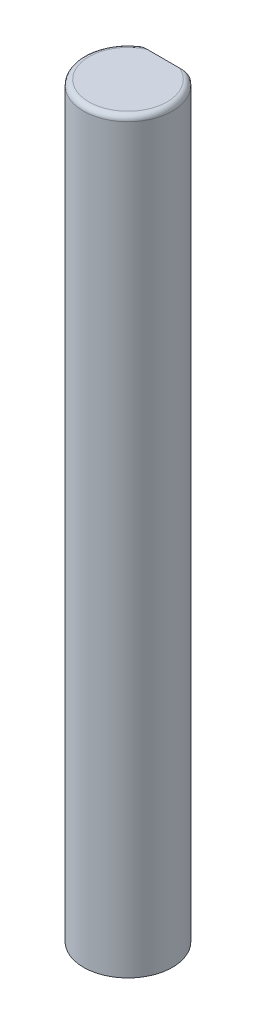
ISO-10303-21;
HEADER;
FILE_DESCRIPTION(('STEP AP214'),'2;1');
FILE_NAME('part.step','',(''),(''),'','','');
FILE_SCHEMA(('AUTOMOTIVE_DESIGN { 1 0 10303 214 1 1 1 1 }'));
ENDSEC;
DATA;
#1=APPLICATION_CONTEXT('core data for automotive mechanical design processes');
#2=APPLICATION_PROTOCOL_DEFINITION('international standard','automotive_design',2000,#1);
#3=PRODUCT_CONTEXT('',#1,'mechanical');
#4=PRODUCT('Part','Part','',(#3));
#5=PRODUCT_RELATED_PRODUCT_CATEGORY('part','',(#4));
#6=PRODUCT_DEFINITION_FORMATION('','',#4);
#7=PRODUCT_DEFINITION_CONTEXT('part definition',#1,'design');
#8=PRODUCT_DEFINITION('design','',#6,#7);
#9=PRODUCT_DEFINITION_SHAPE('','',#8);
#10=(LENGTH_UNIT() NAMED_UNIT(*) SI_UNIT(.MILLI.,.METRE.));
#11=(NAMED_UNIT(*) PLANE_ANGLE_UNIT() SI_UNIT($,.RADIAN.));
#12=(NAMED_UNIT(*) SI_UNIT($,.STERADIAN.) SOLID_ANGLE_UNIT());
#13=UNCERTAINTY_MEASURE_WITH_UNIT(LENGTH_MEASURE(1.E-05),#10,'distance_accuracy_value','');
#14=(GEOMETRIC_REPRESENTATION_CONTEXT(3) GLOBAL_UNCERTAINTY_ASSIGNED_CONTEXT((#13)) GLOBAL_UNIT_ASSIGNED_CONTEXT((#10,
#11,#12)) REPRESENTATION_CONTEXT('',''));
#15=CARTESIAN_POINT('',(0.,0.,0.));
#16=DIRECTION('',(0.,0.,1.));
#17=DIRECTION('',(1.,0.,0.));
#18=AXIS2_PLACEMENT_3D('',#15,#16,#17);
#19=CARTESIAN_POINT('',(0.,42.,0.));
#20=DIRECTION('',(0.,-1.,0.));
#21=DIRECTION('',(0.,0.,-1.));
#22=AXIS2_PLACEMENT_3D('',#19,#20,#21);
#23=CYLINDRICAL_SURFACE('',#22,2.5);
#24=DIRECTION('',(0.,-1.,0.));
#25=VECTOR('',#24,1.);
#26=CARTESIAN_POINT('',(1.5,42.,-2.));
#27=LINE('',#26,#25);
#28=CARTESIAN_POINT('',(1.5,24.,-2.));
#29=VERTEX_POINT('',#28);
#30=CARTESIAN_POINT('',(1.5,41.7,-2.));
#31=VERTEX_POINT('',#30);
#32=EDGE_CURVE('E85',#29,#31,#27,.F.);
#33=ORIENTED_EDGE('',*,*,#32,.T.);
#34=CARTESIAN_POINT('',(0.,41.7,0.));
#35=DIRECTION('',(0.,1.,0.));
#36=DIRECTION('',(0.,0.,1.));
#37=AXIS2_PLACEMENT_3D('',#34,#35,#36);
#38=CIRCLE('',#37,2.5);
#39=CARTESIAN_POINT('',(-1.5,41.7,-2.));
#40=VERTEX_POINT('',#39);
#41=EDGE_CURVE('E11',#31,#40,#38,.F.);
#42=ORIENTED_EDGE('',*,*,#41,.T.);
#43=DIRECTION('',(0.,-1.,0.));
#44=VECTOR('',#43,1.);
#45=CARTESIAN_POINT('',(-1.5,42.,-2.));
#46=LINE('',#45,#44);
#47=CARTESIAN_POINT('',(-1.5,24.,-2.));
#48=VERTEX_POINT('',#47);
#49=EDGE_CURVE('E77',#40,#48,#46,.T.);
#50=ORIENTED_EDGE('',*,*,#49,.T.);
#51=CARTESIAN_POINT('',(0.,24.,0.));
#52=DIRECTION('',(0.,-1.,0.));
#53=DIRECTION('',(0.,0.,-1.));
#54=AXIS2_PLACEMENT_3D('',#51,#52,#53);
#55=CIRCLE('',#54,2.5);
#56=EDGE_CURVE('E80',#48,#29,#55,.T.);
#57=ORIENTED_EDGE('',*,*,#56,.T.);
#58=EDGE_LOOP('',(#33,#42,#50,#57));
#59=FACE_BOUND('',#58,.T.);
#60=CARTESIAN_POINT('',(0.,0.,0.));
#61=DIRECTION('',(0.,1.,0.));
#62=DIRECTION('',(0.,0.,1.));
#63=AXIS2_PLACEMENT_3D('',#60,#61,#62);
#64=CIRCLE('',#63,2.5);
#65=CARTESIAN_POINT('',(0.,0.,2.5));
#66=VERTEX_POINT('',#65);
#67=EDGE_CURVE('E84',#66,#66,#64,.T.);
#68=ORIENTED_EDGE('',*,*,#67,.T.);
#69=EDGE_LOOP('',(#68));
#70=FACE_BOUND('',#69,.T.);
#71=ADVANCED_FACE('F45',(#59,#70),#23,.T.);
#72=CARTESIAN_POINT('',(0.,42.,0.));
#73=DIRECTION('',(0.,1.,0.));
#74=DIRECTION('',(0.,0.,1.));
#75=AXIS2_PLACEMENT_3D('',#72,#73,#74);
#76=PLANE('',#75);
#77=DIRECTION('',(1.,0.,0.));
#78=VECTOR('',#77,1.);
#79=CARTESIAN_POINT('',(0.,42.,-2.));
#80=LINE('',#79,#78);
#81=CARTESIAN_POINT('',(-0.916515138991167,42.,-2.));
#82=VERTEX_POINT('',#81);
#83=CARTESIAN_POINT('',(0.916515138991167,42.,-2.));
#84=VERTEX_POINT('',#83);
#85=EDGE_CURVE('E93',#82,#84,#80,.T.);
#86=ORIENTED_EDGE('',*,*,#85,.F.);
#87=CARTESIAN_POINT('',(0.,42.,0.));
#88=DIRECTION('',(0.,1.,0.));
#89=DIRECTION('',(0.,0.,1.));
#90=AXIS2_PLACEMENT_3D('',#87,#88,#89);
#91=CIRCLE('',#90,2.2);
#92=EDGE_CURVE('E92',#82,#84,#91,.T.);
#93=ORIENTED_EDGE('',*,*,#92,.T.);
#94=EDGE_LOOP('',(#86,#93));
#95=FACE_BOUND('',#94,.T.);
#96=ADVANCED_FACE('F124',(#95),#76,.T.);
#97=CARTESIAN_POINT('',(0.,0.,0.));
#98=DIRECTION('',(0.,1.,0.));
#99=DIRECTION('',(0.,0.,1.));
#100=AXIS2_PLACEMENT_3D('',#97,#98,#99);
#101=PLANE('',#100);
#102=ORIENTED_EDGE('',*,*,#67,.F.);
#103=EDGE_LOOP('',(#102));
#104=FACE_BOUND('',#103,.T.);
#105=ADVANCED_FACE('F128',(#104),#101,.F.);
#106=CARTESIAN_POINT('',(0.,24.,0.));
#107=DIRECTION('',(0.,-1.,0.));
#108=DIRECTION('',(0.,0.,-1.));
#109=AXIS2_PLACEMENT_3D('',#106,#107,#108);
#110=PLANE('',#109);
#111=DIRECTION('',(1.,0.,0.));
#112=VECTOR('',#111,1.);
#113=CARTESIAN_POINT('',(-4.18033626111919,24.,-2.));
#114=LINE('',#113,#112);
#115=EDGE_CURVE('E90',#48,#29,#114,.T.);
#116=ORIENTED_EDGE('',*,*,#115,.T.);
#117=ORIENTED_EDGE('',*,*,#56,.F.);
#118=EDGE_LOOP('',(#116,#117));
#119=FACE_BOUND('',#118,.T.);
#120=ADVANCED_FACE('F89',(#119),#110,.F.);
#121=CARTESIAN_POINT('',(-4.18033626111919,24.,-2.));
#122=DIRECTION('',(0.,0.,1.));
#123=DIRECTION('',(1.,0.,0.));
#124=AXIS2_PLACEMENT_3D('',#121,#122,#123);
#125=PLANE('',#124);
#126=ORIENTED_EDGE('',*,*,#85,.T.);
#127=CARTESIAN_POINT('',(0.916515138991167,42.,-2.));
#128=CARTESIAN_POINT('',(0.947599932353188,41.9999802781559,-2.));
#129=CARTESIAN_POINT('',(0.978726723755185,41.9991583371961,-2.));
#130=CARTESIAN_POINT('',(1.04114904901983,41.9953409293656,-2.));
#131=CARTESIAN_POINT('',(1.07244321141905,41.9923240672488,-2.));
#132=CARTESIAN_POINT('',(1.13530016344848,41.9834357436092,-2.));
#133=CARTESIAN_POINT('',(1.16685529160907,41.9775069850126,-2.));
#134=CARTESIAN_POINT('',(1.22896142796597,41.9619702273655,-2.));
#135=CARTESIAN_POINT('',(1.25951632891891,41.9523789734728,-2.));
#136=CARTESIAN_POINT('',(1.30498609302567,41.9339859735403,-2.));
#137=CARTESIAN_POINT('',(1.32058513754266,41.9268793109369,-2.));
#138=CARTESIAN_POINT('',(1.35094825217045,41.9110882082432,-2.));
#139=CARTESIAN_POINT('',(1.36571359949593,41.902406272462,-2.));
#140=CARTESIAN_POINT('',(1.39417994478869,41.8831386335402,-2.));
#141=CARTESIAN_POINT('',(1.40786896019232,41.8725349361214,-2.));
#142=CARTESIAN_POINT('',(1.43339489276327,41.8492678734221,-2.));
#143=CARTESIAN_POINT('',(1.44523463649557,41.8366077130376,-2.));
#144=CARTESIAN_POINT('',(1.46285900087057,41.8135106476709,-2.));
#145=CARTESIAN_POINT('',(1.46937509991116,41.8036340536974,-2.));
#146=CARTESIAN_POINT('',(1.48075572808713,41.7829883562342,-2.));
#147=CARTESIAN_POINT('',(1.48562484769663,41.7722218392784,-2.));
#148=CARTESIAN_POINT('',(1.49289524761883,41.7513369085001,-2.));
#149=CARTESIAN_POINT('',(1.49552445714329,41.7412986359284,-2.));
#150=CARTESIAN_POINT('',(1.49909365333132,41.7208492233069,-2.));
#151=CARTESIAN_POINT('',(1.50002041131743,41.7104357990612,-2.));
#152=CARTESIAN_POINT('',(1.5,41.7,-2.));
#153=B_SPLINE_CURVE_WITH_KNOTS('',3,(#127,#128,#129,#130,#131,#132,#133,#134,#135,#136,#137,
#138,#139,#140,#141,#142,#143,#144,#145,#146,#147,#148,#149,#150,#151,#152),.UNSPECIFIED.,.F.,
.F.,(4,2,2,2,2,2,2,2,2,2,2,2,4),(0.,0.0933095818000357,0.187541107399812,0.283705953529208,
0.379436292625799,0.430789597587389,0.482061967156292,0.533841870951629,0.585541839191322,
0.620916553217951,0.656191842077164,0.687182119655989,0.718412200768318),.UNSPECIFIED.);
#154=EDGE_CURVE('E55',#84,#31,#153,.T.);
#155=ORIENTED_EDGE('',*,*,#154,.T.);
#156=ORIENTED_EDGE('',*,*,#32,.F.);
#157=ORIENTED_EDGE('',*,*,#115,.F.);
#158=ORIENTED_EDGE('',*,*,#49,.F.);
#159=CARTESIAN_POINT('',(-1.5,41.7,-2.));
#160=CARTESIAN_POINT('',(-1.50003559102239,41.7121501293466,-2.));
#161=CARTESIAN_POINT('',(-1.49877244515557,41.7242578043947,-2.));
#162=CARTESIAN_POINT('',(-1.49396821102334,41.747879784032,-2.));
#163=CARTESIAN_POINT('',(-1.49045245826753,41.7593991684017,-2.));
#164=CARTESIAN_POINT('',(-1.48146802359068,41.7815772283284,-2.));
#165=CARTESIAN_POINT('',(-1.47600712748122,41.7922391305152,-2.));
#166=CARTESIAN_POINT('',(-1.46350752760729,41.8126179968912,-2.));
#167=CARTESIAN_POINT('',(-1.456464233866,41.8223320918327,-2.));
#168=CARTESIAN_POINT('',(-1.43738334103407,41.8452792916075,-2.));
#169=CARTESIAN_POINT('',(-1.42459542743351,41.8578862283405,-2.));
#170=CARTESIAN_POINT('',(-1.39722905149911,41.8809444992727,-2.));
#171=CARTESIAN_POINT('',(-1.38264768968763,41.8913922676778,-2.));
#172=CARTESIAN_POINT('',(-1.34266383370208,41.9164263629838,-2.));
#173=CARTESIAN_POINT('',(-1.31627379399085,41.929422770141,-2.));
#174=CARTESIAN_POINT('',(-1.26179396651077,41.9514548381852,-2.));
#175=CARTESIAN_POINT('',(-1.23369455307765,41.960465137054,-2.));
#176=CARTESIAN_POINT('',(-1.18142174434979,41.9740641484517,-2.));
#177=CARTESIAN_POINT('',(-1.15737017085927,41.9791383532616,-2.));
#178=CARTESIAN_POINT('',(-1.10892983356083,41.98745850303,-2.));
#179=CARTESIAN_POINT('',(-1.08454068631911,41.9907021578811,-2.));
#180=CARTESIAN_POINT('',(-1.03620042502433,41.9956116756145,-2.));
#181=CARTESIAN_POINT('',(-1.0122527565377,41.9973133621148,-2.));
#182=CARTESIAN_POINT('',(-0.964370980700276,41.9995026233784,-2.));
#183=CARTESIAN_POINT('',(-0.940437042725083,41.999993774153,-2.));
#184=CARTESIAN_POINT('',(-0.916515138991166,42.,-2.));
#185=B_SPLINE_CURVE_WITH_KNOTS('',3,(#159,#160,#161,#162,#163,#164,#165,#166,#167,#168,#169,
#170,#171,#172,#173,#174,#175,#176,#177,#178,#179,#180,#181,#182,#183,#184),.UNSPECIFIED.,.F.,
.F.,(4,2,2,2,2,2,2,2,2,2,2,2,4),(0.,0.0363176162822238,0.0722337652014306,0.10800773912753,
0.143886852064561,0.197454598116364,0.25111011476732,0.338866854323847,0.427174194931268,
0.500835056047567,0.574587867367115,0.646579686809692,0.718358580869713),.UNSPECIFIED.);
#186=EDGE_CURVE('E109',#40,#82,#185,.T.);
#187=ORIENTED_EDGE('',*,*,#186,.T.);
#188=EDGE_LOOP('',(#126,#155,#156,#157,#158,#187));
#189=FACE_BOUND('',#188,.T.);
#190=ADVANCED_FACE('F95',(#189),#125,.F.);
#191=CARTESIAN_POINT('',(0.,41.7,0.));
#192=DIRECTION('',(0.,1.,0.));
#193=DIRECTION('',(0.,0.,1.));
#194=AXIS2_PLACEMENT_3D('',#191,#192,#193);
#195=TOROIDAL_SURFACE('',#194,2.2,0.3);
#196=ORIENTED_EDGE('',*,*,#186,.F.);
#197=ORIENTED_EDGE('',*,*,#41,.F.);
#198=ORIENTED_EDGE('',*,*,#154,.F.);
#199=ORIENTED_EDGE('',*,*,#92,.F.);
#200=EDGE_LOOP('',(#196,#197,#198,#199));
#201=FACE_BOUND('',#200,.T.);
#202=ADVANCED_FACE('F47',(#201),#195,.T.);
#203=CLOSED_SHELL('',(#71,#96,#105,#120,#190,#202));
#204=MANIFOLD_SOLID_BREP('B2',#203);
#205=ADVANCED_BREP_SHAPE_REPRESENTATION('',(#18,#204),#14);
#206=SHAPE_DEFINITION_REPRESENTATION(#9,#205);
ENDSEC;
END-ISO-10303-21;
